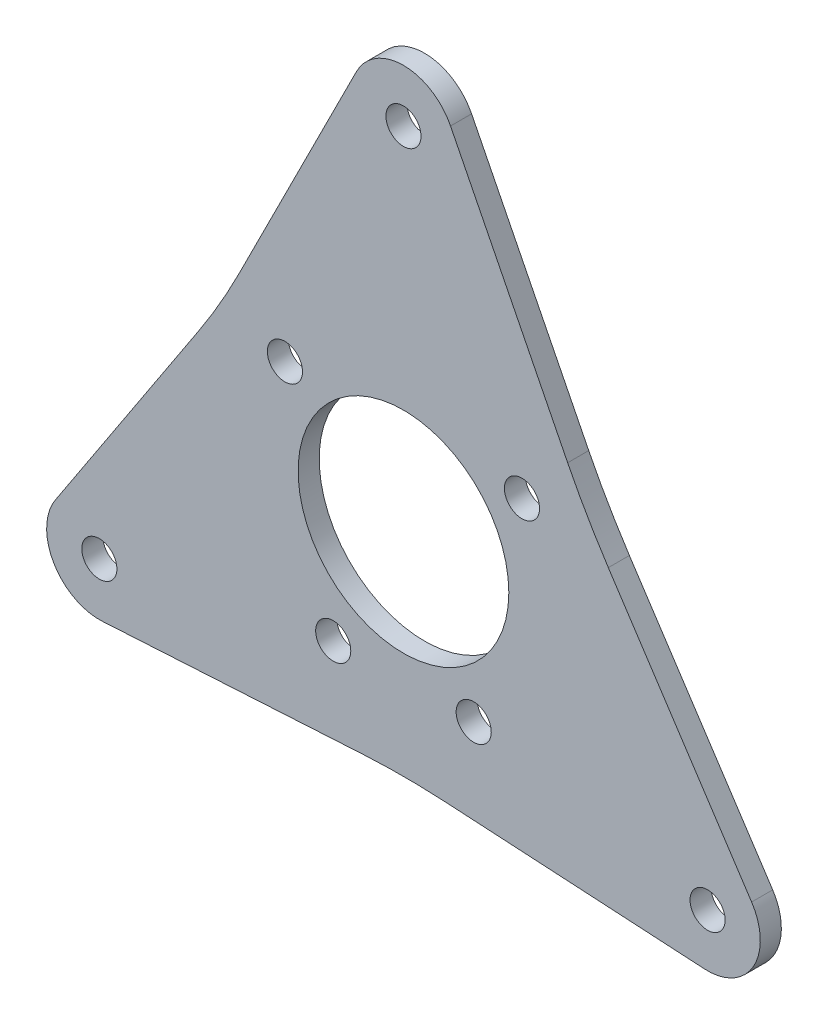
ISO-10303-21;
HEADER;
FILE_DESCRIPTION(('STEP AP214'),'2;1');
FILE_NAME('part.step','',(''),(''),'','','');
FILE_SCHEMA(('AUTOMOTIVE_DESIGN { 1 0 10303 214 1 1 1 1 }'));
ENDSEC;
DATA;
#1=APPLICATION_CONTEXT('core data for automotive mechanical design processes');
#2=APPLICATION_PROTOCOL_DEFINITION('international standard','automotive_design',2000,#1);
#3=PRODUCT_CONTEXT('',#1,'mechanical');
#4=PRODUCT('Part','Part','',(#3));
#5=PRODUCT_RELATED_PRODUCT_CATEGORY('part','',(#4));
#6=PRODUCT_DEFINITION_FORMATION('','',#4);
#7=PRODUCT_DEFINITION_CONTEXT('part definition',#1,'design');
#8=PRODUCT_DEFINITION('design','',#6,#7);
#9=PRODUCT_DEFINITION_SHAPE('','',#8);
#10=(LENGTH_UNIT() NAMED_UNIT(*) SI_UNIT(.MILLI.,.METRE.));
#11=(NAMED_UNIT(*) PLANE_ANGLE_UNIT() SI_UNIT($,.RADIAN.));
#12=(NAMED_UNIT(*) SI_UNIT($,.STERADIAN.) SOLID_ANGLE_UNIT());
#13=UNCERTAINTY_MEASURE_WITH_UNIT(LENGTH_MEASURE(1.E-05),#10,'distance_accuracy_value','');
#14=(GEOMETRIC_REPRESENTATION_CONTEXT(3) GLOBAL_UNCERTAINTY_ASSIGNED_CONTEXT((#13)) GLOBAL_UNIT_ASSIGNED_CONTEXT((#10,
#11,#12)) REPRESENTATION_CONTEXT('',''));
#15=CARTESIAN_POINT('',(0.,0.,0.));
#16=DIRECTION('',(0.,0.,1.));
#17=DIRECTION('',(1.,0.,0.));
#18=AXIS2_PLACEMENT_3D('',#15,#16,#17);
#19=CARTESIAN_POINT('',(-86.6025403784439,-50.,6.));
#20=DIRECTION('',(0.,0.,1.));
#21=DIRECTION('',(1.,0.,0.));
#22=AXIS2_PLACEMENT_3D('',#19,#20,#21);
#23=PLANE('',#22);
#24=CARTESIAN_POINT('',(-20.,-36.9323706252388,6.));
#25=DIRECTION('',(0.,0.,1.));
#26=DIRECTION('',(1.,0.,0.));
#27=AXIS2_PLACEMENT_3D('',#24,#25,#26);
#28=CIRCLE('',#27,5.);
#29=CARTESIAN_POINT('',(-15.,-36.9323706252388,6.));
#30=VERTEX_POINT('',#29);
#31=EDGE_CURVE('E309',#30,#30,#28,.T.);
#32=ORIENTED_EDGE('',*,*,#31,.F.);
#33=EDGE_LOOP('',(#32));
#34=FACE_BOUND('',#33,.T.);
#35=CARTESIAN_POINT('',(-33.75,25.0610766091262,6.));
#36=DIRECTION('',(0.,0.,1.));
#37=DIRECTION('',(1.,0.,0.));
#38=AXIS2_PLACEMENT_3D('',#35,#36,#37);
#39=CIRCLE('',#38,5.);
#40=CARTESIAN_POINT('',(-28.75,25.0610766091262,6.));
#41=VERTEX_POINT('',#40);
#42=EDGE_CURVE('E321',#41,#41,#39,.T.);
#43=ORIENTED_EDGE('',*,*,#42,.F.);
#44=EDGE_LOOP('',(#43));
#45=FACE_BOUND('',#44,.T.);
#46=CARTESIAN_POINT('',(86.6025403784439,-50.,6.));
#47=DIRECTION('',(0.,0.,1.));
#48=DIRECTION('',(1.,0.,0.));
#49=AXIS2_PLACEMENT_3D('',#46,#47,#48);
#50=CIRCLE('',#49,4.99999999999999);
#51=CARTESIAN_POINT('',(91.6025403784439,-50.,6.));
#52=VERTEX_POINT('',#51);
#53=EDGE_CURVE('E333',#52,#52,#50,.T.);
#54=ORIENTED_EDGE('',*,*,#53,.F.);
#55=EDGE_LOOP('',(#54));
#56=FACE_BOUND('',#55,.T.);
#57=CARTESIAN_POINT('',(0.,100.,6.));
#58=DIRECTION('',(0.,0.,1.));
#59=DIRECTION('',(1.,0.,0.));
#60=AXIS2_PLACEMENT_3D('',#57,#58,#59);
#61=CIRCLE('',#60,5.00000000000001);
#62=CARTESIAN_POINT('',(5.00000000000005,100.,6.));
#63=VERTEX_POINT('',#62);
#64=EDGE_CURVE('E160',#63,#63,#61,.T.);
#65=ORIENTED_EDGE('',*,*,#64,.F.);
#66=EDGE_LOOP('',(#65));
#67=FACE_BOUND('',#66,.T.);
#68=CARTESIAN_POINT('',(-86.6025403784439,-50.,6.));
#69=DIRECTION('',(0.,0.,1.));
#70=DIRECTION('',(1.,0.,0.));
#71=AXIS2_PLACEMENT_3D('',#68,#69,#70);
#72=CIRCLE('',#71,15.);
#73=CARTESIAN_POINT('',(-99.1366397981605,-41.7600757444828,6.));
#74=VERTEX_POINT('',#73);
#75=CARTESIAN_POINT('',(-85.7336063577647,-64.974810638793,6.));
#76=VERTEX_POINT('',#75);
#77=EDGE_CURVE('E179',#74,#76,#72,.T.);
#78=ORIENTED_EDGE('',*,*,#77,.T.);
#79=DIRECTION('',(0.998320709252863,0.0579289347119454,0.));
#80=VECTOR('',#79,1.);
#81=CARTESIAN_POINT('',(-85.7336063577647,-64.974810638793,6.));
#82=LINE('',#81,#80);
#83=CARTESIAN_POINT('',(-11.5857869423888,-60.6722812510564,6.));
#84=VERTEX_POINT('',#83);
#85=EDGE_CURVE('E107',#76,#84,#82,.T.);
#86=ORIENTED_EDGE('',*,*,#85,.T.);
#87=CARTESIAN_POINT('',(0.,-260.336423101629,6.));
#88=DIRECTION('',(0.,0.,-1.));
#89=DIRECTION('',(-1.,0.,0.));
#90=AXIS2_PLACEMENT_3D('',#87,#88,#89);
#91=CIRCLE('',#90,200.);
#92=CARTESIAN_POINT('',(11.5857869423888,-60.6722812510564,6.));
#93=VERTEX_POINT('',#92);
#94=EDGE_CURVE('E206',#84,#93,#91,.T.);
#95=ORIENTED_EDGE('',*,*,#94,.T.);
#96=DIRECTION('',(0.998320709252863,-0.0579289347119454,0.));
#97=VECTOR('',#96,1.);
#98=CARTESIAN_POINT('',(11.5857869423888,-60.6722812510564,6.));
#99=LINE('',#98,#97);
#100=CARTESIAN_POINT('',(85.7336063577647,-64.974810638793,6.));
#101=VERTEX_POINT('',#100);
#102=EDGE_CURVE('E225',#93,#101,#99,.T.);
#103=ORIENTED_EDGE('',*,*,#102,.T.);
#104=CARTESIAN_POINT('',(86.6025403784439,-50.,6.));
#105=DIRECTION('',(0.,0.,1.));
#106=DIRECTION('',(1.,0.,0.));
#107=AXIS2_PLACEMENT_3D('',#104,#105,#106);
#108=CIRCLE('',#107,15.);
#109=CARTESIAN_POINT('',(99.1366397981605,-41.7600757444828,6.));
#110=VERTEX_POINT('',#109);
#111=EDGE_CURVE('E222',#101,#110,#108,.T.);
#112=ORIENTED_EDGE('',*,*,#111,.T.);
#113=DIRECTION('',(-0.549328283701145,0.835606627981106,0.));
#114=VECTOR('',#113,1.);
#115=CARTESIAN_POINT('',(58.3366303401639,20.3025548105852,6.));
#116=LINE('',#115,#114);
#117=CARTESIAN_POINT('',(58.3366303401638,20.3025548105853,6.));
#118=VERTEX_POINT('',#117);
#119=EDGE_CURVE('E224',#110,#118,#116,.T.);
#120=ORIENTED_EDGE('',*,*,#119,.T.);
#121=CARTESIAN_POINT('',(225.457955936385,130.168211550814,6.));
#122=DIRECTION('',(0.,0.,-1.));
#123=DIRECTION('',(1.,0.,0.));
#124=AXIS2_PLACEMENT_3D('',#121,#122,#123);
#125=CIRCLE('',#124,200.);
#126=CARTESIAN_POINT('',(46.750843397775,40.3697264404707,6.));
#127=VERTEX_POINT('',#126);
#128=EDGE_CURVE('E227',#118,#127,#125,.T.);
#129=ORIENTED_EDGE('',*,*,#128,.T.);
#130=DIRECTION('',(-0.448992425551717,0.89353556269305,0.));
#131=VECTOR('',#130,1.);
#132=CARTESIAN_POINT('',(13.4030334403958,106.734886383276,6.));
#133=LINE('',#132,#131);
#134=CARTESIAN_POINT('',(13.4030334403958,106.734886383276,6.));
#135=VERTEX_POINT('',#134);
#136=EDGE_CURVE('E233',#127,#135,#133,.T.);
#137=ORIENTED_EDGE('',*,*,#136,.T.);
#138=CARTESIAN_POINT('',(0.,100.,6.));
#139=DIRECTION('',(0.,0.,1.));
#140=DIRECTION('',(1.,0.,0.));
#141=AXIS2_PLACEMENT_3D('',#138,#139,#140);
#142=CIRCLE('',#141,15.);
#143=CARTESIAN_POINT('',(-13.4030334403958,106.734886383276,6.));
#144=VERTEX_POINT('',#143);
#145=EDGE_CURVE('E138',#135,#144,#142,.T.);
#146=ORIENTED_EDGE('',*,*,#145,.T.);
#147=DIRECTION('',(-0.448992425551717,-0.89353556269305,0.));
#148=VECTOR('',#147,1.);
#149=CARTESIAN_POINT('',(-46.750843397775,40.3697264404707,6.));
#150=LINE('',#149,#148);
#151=CARTESIAN_POINT('',(-46.750843397775,40.3697264404707,6.));
#152=VERTEX_POINT('',#151);
#153=EDGE_CURVE('E132',#144,#152,#150,.T.);
#154=ORIENTED_EDGE('',*,*,#153,.T.);
#155=CARTESIAN_POINT('',(-225.457955936385,130.168211550814,6.));
#156=DIRECTION('',(0.,0.,-1.));
#157=DIRECTION('',(1.,0.,0.));
#158=AXIS2_PLACEMENT_3D('',#155,#156,#157);
#159=CIRCLE('',#158,200.);
#160=CARTESIAN_POINT('',(-58.3366303401639,20.3025548105852,6.));
#161=VERTEX_POINT('',#160);
#162=EDGE_CURVE('E136',#152,#161,#159,.T.);
#163=ORIENTED_EDGE('',*,*,#162,.T.);
#164=DIRECTION('',(-0.549328283701145,-0.835606627981106,0.));
#165=VECTOR('',#164,1.);
#166=CARTESIAN_POINT('',(-99.1366397981605,-41.7600757444828,6.));
#167=LINE('',#166,#165);
#168=EDGE_CURVE('E52',#161,#74,#167,.T.);
#169=ORIENTED_EDGE('',*,*,#168,.T.);
#170=EDGE_LOOP('',(#78,#86,#95,#103,#112,#120,#129,#137,#146,#154,#163,#169));
#171=FACE_BOUND('',#170,.T.);
#172=CARTESIAN_POINT('',(0.,0.,6.));
#173=DIRECTION('',(0.,0.,1.));
#174=DIRECTION('',(1.,0.,0.));
#175=AXIS2_PLACEMENT_3D('',#172,#173,#174);
#176=CIRCLE('',#175,30.);
#177=CARTESIAN_POINT('',(30.,0.,6.));
#178=VERTEX_POINT('',#177);
#179=EDGE_CURVE('E339',#178,#178,#176,.T.);
#180=ORIENTED_EDGE('',*,*,#179,.F.);
#181=EDGE_LOOP('',(#180));
#182=FACE_BOUND('',#181,.T.);
#183=CARTESIAN_POINT('',(-86.6025403784439,-50.,6.));
#184=DIRECTION('',(0.,0.,1.));
#185=DIRECTION('',(1.,0.,0.));
#186=AXIS2_PLACEMENT_3D('',#183,#184,#185);
#187=CIRCLE('',#186,5.00000000000002);
#188=CARTESIAN_POINT('',(-81.6025403784439,-50.,6.));
#189=VERTEX_POINT('',#188);
#190=EDGE_CURVE('E327',#189,#189,#187,.T.);
#191=ORIENTED_EDGE('',*,*,#190,.F.);
#192=EDGE_LOOP('',(#191));
#193=FACE_BOUND('',#192,.T.);
#194=CARTESIAN_POINT('',(33.75,25.0610766091262,6.));
#195=DIRECTION('',(0.,0.,1.));
#196=DIRECTION('',(1.,0.,0.));
#197=AXIS2_PLACEMENT_3D('',#194,#195,#196);
#198=CIRCLE('',#197,4.99999999999999);
#199=CARTESIAN_POINT('',(38.75,25.0610766091262,6.));
#200=VERTEX_POINT('',#199);
#201=EDGE_CURVE('E315',#200,#200,#198,.T.);
#202=ORIENTED_EDGE('',*,*,#201,.F.);
#203=EDGE_LOOP('',(#202));
#204=FACE_BOUND('',#203,.T.);
#205=CARTESIAN_POINT('',(20.,-36.9323706252388,6.));
#206=DIRECTION('',(0.,0.,1.));
#207=DIRECTION('',(1.,0.,0.));
#208=AXIS2_PLACEMENT_3D('',#205,#206,#207);
#209=CIRCLE('',#208,5.);
#210=CARTESIAN_POINT('',(25.,-36.9323706252388,6.));
#211=VERTEX_POINT('',#210);
#212=EDGE_CURVE('E300',#211,#211,#209,.T.);
#213=ORIENTED_EDGE('',*,*,#212,.F.);
#214=EDGE_LOOP('',(#213));
#215=FACE_BOUND('',#214,.T.);
#216=ADVANCED_FACE('F35',(#34,#45,#56,#67,#171,#182,#193,#204,#215),#23,.T.);
#217=CARTESIAN_POINT('',(-86.6025403784439,-50.,0.));
#218=DIRECTION('',(0.,0.,1.));
#219=DIRECTION('',(1.,0.,0.));
#220=AXIS2_PLACEMENT_3D('',#217,#218,#219);
#221=PLANE('',#220);
#222=CARTESIAN_POINT('',(-86.6025403784439,-50.,0.));
#223=DIRECTION('',(0.,0.,1.));
#224=DIRECTION('',(1.,0.,0.));
#225=AXIS2_PLACEMENT_3D('',#222,#223,#224);
#226=CIRCLE('',#225,15.);
#227=CARTESIAN_POINT('',(-99.1366397981605,-41.7600757444828,0.));
#228=VERTEX_POINT('',#227);
#229=CARTESIAN_POINT('',(-85.7336063577647,-64.974810638793,0.));
#230=VERTEX_POINT('',#229);
#231=EDGE_CURVE('E156',#228,#230,#226,.T.);
#232=ORIENTED_EDGE('',*,*,#231,.F.);
#233=DIRECTION('',(-0.549328283701145,-0.835606627981106,0.));
#234=VECTOR('',#233,1.);
#235=CARTESIAN_POINT('',(-99.1366397981605,-41.7600757444828,0.));
#236=LINE('',#235,#234);
#237=CARTESIAN_POINT('',(-58.3366303401639,20.3025548105852,0.));
#238=VERTEX_POINT('',#237);
#239=EDGE_CURVE('E99',#238,#228,#236,.T.);
#240=ORIENTED_EDGE('',*,*,#239,.F.);
#241=CARTESIAN_POINT('',(-225.457955936385,130.168211550814,0.));
#242=DIRECTION('',(0.,0.,-1.));
#243=DIRECTION('',(1.,0.,0.));
#244=AXIS2_PLACEMENT_3D('',#241,#242,#243);
#245=CIRCLE('',#244,200.);
#246=CARTESIAN_POINT('',(-46.750843397775,40.3697264404707,0.));
#247=VERTEX_POINT('',#246);
#248=EDGE_CURVE('E93',#247,#238,#245,.T.);
#249=ORIENTED_EDGE('',*,*,#248,.F.);
#250=DIRECTION('',(-0.448992425551717,-0.89353556269305,0.));
#251=VECTOR('',#250,1.);
#252=CARTESIAN_POINT('',(-46.750843397775,40.3697264404707,0.));
#253=LINE('',#252,#251);
#254=CARTESIAN_POINT('',(-13.4030334403958,106.734886383276,0.));
#255=VERTEX_POINT('',#254);
#256=EDGE_CURVE('E146',#255,#247,#253,.T.);
#257=ORIENTED_EDGE('',*,*,#256,.F.);
#258=CARTESIAN_POINT('',(0.,100.,0.));
#259=DIRECTION('',(0.,0.,1.));
#260=DIRECTION('',(1.,0.,0.));
#261=AXIS2_PLACEMENT_3D('',#258,#259,#260);
#262=CIRCLE('',#261,15.);
#263=CARTESIAN_POINT('',(13.4030334403958,106.734886383276,0.));
#264=VERTEX_POINT('',#263);
#265=EDGE_CURVE('E174',#264,#255,#262,.T.);
#266=ORIENTED_EDGE('',*,*,#265,.F.);
#267=DIRECTION('',(-0.448992425551717,0.89353556269305,0.));
#268=VECTOR('',#267,1.);
#269=CARTESIAN_POINT('',(13.4030334403958,106.734886383276,0.));
#270=LINE('',#269,#268);
#271=CARTESIAN_POINT('',(46.750843397775,40.3697264404707,0.));
#272=VERTEX_POINT('',#271);
#273=EDGE_CURVE('E172',#272,#264,#270,.T.);
#274=ORIENTED_EDGE('',*,*,#273,.F.);
#275=CARTESIAN_POINT('',(225.457955936385,130.168211550814,0.));
#276=DIRECTION('',(0.,0.,-1.));
#277=DIRECTION('',(1.,0.,0.));
#278=AXIS2_PLACEMENT_3D('',#275,#276,#277);
#279=CIRCLE('',#278,200.);
#280=CARTESIAN_POINT('',(58.3366303401638,20.3025548105853,0.));
#281=VERTEX_POINT('',#280);
#282=EDGE_CURVE('E170',#281,#272,#279,.T.);
#283=ORIENTED_EDGE('',*,*,#282,.F.);
#284=DIRECTION('',(-0.549328283701145,0.835606627981106,0.));
#285=VECTOR('',#284,1.);
#286=CARTESIAN_POINT('',(58.3366303401639,20.3025548105852,0.));
#287=LINE('',#286,#285);
#288=CARTESIAN_POINT('',(99.1366397981605,-41.7600757444828,0.));
#289=VERTEX_POINT('',#288);
#290=EDGE_CURVE('E168',#289,#281,#287,.T.);
#291=ORIENTED_EDGE('',*,*,#290,.F.);
#292=CARTESIAN_POINT('',(86.6025403784439,-50.,0.));
#293=DIRECTION('',(0.,0.,1.));
#294=DIRECTION('',(1.,0.,0.));
#295=AXIS2_PLACEMENT_3D('',#292,#293,#294);
#296=CIRCLE('',#295,15.);
#297=CARTESIAN_POINT('',(85.7336063577647,-64.974810638793,0.));
#298=VERTEX_POINT('',#297);
#299=EDGE_CURVE('E166',#298,#289,#296,.T.);
#300=ORIENTED_EDGE('',*,*,#299,.F.);
#301=DIRECTION('',(0.998320709252863,-0.0579289347119454,0.));
#302=VECTOR('',#301,1.);
#303=CARTESIAN_POINT('',(11.5857869423888,-60.6722812510564,0.));
#304=LINE('',#303,#302);
#305=CARTESIAN_POINT('',(11.5857869423888,-60.6722812510564,0.));
#306=VERTEX_POINT('',#305);
#307=EDGE_CURVE('E164',#306,#298,#304,.T.);
#308=ORIENTED_EDGE('',*,*,#307,.F.);
#309=CARTESIAN_POINT('',(0.,-260.336423101629,0.));
#310=DIRECTION('',(0.,0.,-1.));
#311=DIRECTION('',(-1.,0.,0.));
#312=AXIS2_PLACEMENT_3D('',#309,#310,#311);
#313=CIRCLE('',#312,200.);
#314=CARTESIAN_POINT('',(-11.5857869423888,-60.6722812510564,0.));
#315=VERTEX_POINT('',#314);
#316=EDGE_CURVE('E162',#315,#306,#313,.T.);
#317=ORIENTED_EDGE('',*,*,#316,.F.);
#318=DIRECTION('',(0.998320709252863,0.0579289347119454,0.));
#319=VECTOR('',#318,1.);
#320=CARTESIAN_POINT('',(-85.7336063577647,-64.974810638793,0.));
#321=LINE('',#320,#319);
#322=EDGE_CURVE('E159',#230,#315,#321,.T.);
#323=ORIENTED_EDGE('',*,*,#322,.F.);
#324=EDGE_LOOP('',(#232,#240,#249,#257,#266,#274,#283,#291,#300,#308,#317,#323));
#325=FACE_BOUND('',#324,.T.);
#326=CARTESIAN_POINT('',(0.,100.,0.));
#327=DIRECTION('',(0.,0.,1.));
#328=DIRECTION('',(1.,0.,0.));
#329=AXIS2_PLACEMENT_3D('',#326,#327,#328);
#330=CIRCLE('',#329,5.00000000000001);
#331=CARTESIAN_POINT('',(5.00000000000005,100.,0.));
#332=VERTEX_POINT('',#331);
#333=EDGE_CURVE('E342',#332,#332,#330,.T.);
#334=ORIENTED_EDGE('',*,*,#333,.T.);
#335=EDGE_LOOP('',(#334));
#336=FACE_BOUND('',#335,.T.);
#337=CARTESIAN_POINT('',(0.,0.,0.));
#338=DIRECTION('',(0.,0.,1.));
#339=DIRECTION('',(1.,0.,0.));
#340=AXIS2_PLACEMENT_3D('',#337,#338,#339);
#341=CIRCLE('',#340,30.);
#342=CARTESIAN_POINT('',(30.,0.,0.));
#343=VERTEX_POINT('',#342);
#344=EDGE_CURVE('E336',#343,#343,#341,.T.);
#345=ORIENTED_EDGE('',*,*,#344,.T.);
#346=EDGE_LOOP('',(#345));
#347=FACE_BOUND('',#346,.T.);
#348=CARTESIAN_POINT('',(86.6025403784439,-50.,0.));
#349=DIRECTION('',(0.,0.,1.));
#350=DIRECTION('',(1.,0.,0.));
#351=AXIS2_PLACEMENT_3D('',#348,#349,#350);
#352=CIRCLE('',#351,4.99999999999999);
#353=CARTESIAN_POINT('',(91.6025403784439,-50.,0.));
#354=VERTEX_POINT('',#353);
#355=EDGE_CURVE('E330',#354,#354,#352,.T.);
#356=ORIENTED_EDGE('',*,*,#355,.T.);
#357=EDGE_LOOP('',(#356));
#358=FACE_BOUND('',#357,.T.);
#359=CARTESIAN_POINT('',(-86.6025403784439,-50.,0.));
#360=DIRECTION('',(0.,0.,1.));
#361=DIRECTION('',(1.,0.,0.));
#362=AXIS2_PLACEMENT_3D('',#359,#360,#361);
#363=CIRCLE('',#362,5.00000000000002);
#364=CARTESIAN_POINT('',(-81.6025403784439,-50.,0.));
#365=VERTEX_POINT('',#364);
#366=EDGE_CURVE('E324',#365,#365,#363,.T.);
#367=ORIENTED_EDGE('',*,*,#366,.T.);
#368=EDGE_LOOP('',(#367));
#369=FACE_BOUND('',#368,.T.);
#370=CARTESIAN_POINT('',(-33.75,25.0610766091262,0.));
#371=DIRECTION('',(0.,0.,1.));
#372=DIRECTION('',(1.,0.,0.));
#373=AXIS2_PLACEMENT_3D('',#370,#371,#372);
#374=CIRCLE('',#373,5.);
#375=CARTESIAN_POINT('',(-28.75,25.0610766091262,0.));
#376=VERTEX_POINT('',#375);
#377=EDGE_CURVE('E318',#376,#376,#374,.T.);
#378=ORIENTED_EDGE('',*,*,#377,.T.);
#379=EDGE_LOOP('',(#378));
#380=FACE_BOUND('',#379,.T.);
#381=CARTESIAN_POINT('',(33.75,25.0610766091262,0.));
#382=DIRECTION('',(0.,0.,1.));
#383=DIRECTION('',(1.,0.,0.));
#384=AXIS2_PLACEMENT_3D('',#381,#382,#383);
#385=CIRCLE('',#384,4.99999999999999);
#386=CARTESIAN_POINT('',(38.75,25.0610766091262,0.));
#387=VERTEX_POINT('',#386);
#388=EDGE_CURVE('E312',#387,#387,#385,.T.);
#389=ORIENTED_EDGE('',*,*,#388,.T.);
#390=EDGE_LOOP('',(#389));
#391=FACE_BOUND('',#390,.T.);
#392=CARTESIAN_POINT('',(-20.,-36.9323706252388,0.));
#393=DIRECTION('',(0.,0.,1.));
#394=DIRECTION('',(1.,0.,0.));
#395=AXIS2_PLACEMENT_3D('',#392,#393,#394);
#396=CIRCLE('',#395,5.);
#397=CARTESIAN_POINT('',(-15.,-36.9323706252388,0.));
#398=VERTEX_POINT('',#397);
#399=EDGE_CURVE('E306',#398,#398,#396,.T.);
#400=ORIENTED_EDGE('',*,*,#399,.T.);
#401=EDGE_LOOP('',(#400));
#402=FACE_BOUND('',#401,.T.);
#403=CARTESIAN_POINT('',(20.,-36.9323706252388,0.));
#404=DIRECTION('',(0.,0.,1.));
#405=DIRECTION('',(1.,0.,0.));
#406=AXIS2_PLACEMENT_3D('',#403,#404,#405);
#407=CIRCLE('',#406,5.);
#408=CARTESIAN_POINT('',(25.,-36.9323706252388,0.));
#409=VERTEX_POINT('',#408);
#410=EDGE_CURVE('E303',#409,#409,#407,.T.);
#411=ORIENTED_EDGE('',*,*,#410,.T.);
#412=EDGE_LOOP('',(#411));
#413=FACE_BOUND('',#412,.T.);
#414=ADVANCED_FACE('F210',(#325,#336,#347,#358,#369,#380,#391,#402,#413),#221,.F.);
#415=CARTESIAN_POINT('',(-86.6025403784439,-50.,6.));
#416=DIRECTION('',(0.,0.,-1.));
#417=DIRECTION('',(-1.,0.,0.));
#418=AXIS2_PLACEMENT_3D('',#415,#416,#417);
#419=CYLINDRICAL_SURFACE('',#418,15.);
#420=ORIENTED_EDGE('',*,*,#231,.T.);
#421=DIRECTION('',(0.,0.,-1.));
#422=VECTOR('',#421,1.);
#423=CARTESIAN_POINT('',(-85.7336063577647,-64.974810638793,6.));
#424=LINE('',#423,#422);
#425=EDGE_CURVE('E11',#76,#230,#424,.T.);
#426=ORIENTED_EDGE('',*,*,#425,.F.);
#427=ORIENTED_EDGE('',*,*,#77,.F.);
#428=DIRECTION('',(0.,0.,-1.));
#429=VECTOR('',#428,1.);
#430=CARTESIAN_POINT('',(-99.1366397981605,-41.7600757444828,6.));
#431=LINE('',#430,#429);
#432=EDGE_CURVE('E152',#74,#228,#431,.T.);
#433=ORIENTED_EDGE('',*,*,#432,.T.);
#434=EDGE_LOOP('',(#420,#426,#427,#433));
#435=FACE_BOUND('',#434,.T.);
#436=ADVANCED_FACE('F37',(#435),#419,.T.);
#437=CARTESIAN_POINT('',(-85.7336063577647,-64.974810638793,6.));
#438=DIRECTION('',(-0.0579289347119454,0.998320709252863,0.));
#439=DIRECTION('',(-0.998320709252863,-0.0579289347119454,0.));
#440=AXIS2_PLACEMENT_3D('',#437,#438,#439);
#441=PLANE('',#440);
#442=ORIENTED_EDGE('',*,*,#322,.T.);
#443=DIRECTION('',(0.,0.,-1.));
#444=VECTOR('',#443,1.);
#445=CARTESIAN_POINT('',(-11.5857869423888,-60.6722812510564,6.));
#446=LINE('',#445,#444);
#447=EDGE_CURVE('E44',#84,#315,#446,.T.);
#448=ORIENTED_EDGE('',*,*,#447,.F.);
#449=ORIENTED_EDGE('',*,*,#85,.F.);
#450=ORIENTED_EDGE('',*,*,#425,.T.);
#451=EDGE_LOOP('',(#442,#448,#449,#450));
#452=FACE_BOUND('',#451,.T.);
#453=ADVANCED_FACE('F488',(#452),#441,.F.);
#454=CARTESIAN_POINT('',(0.,-260.336423101629,6.));
#455=DIRECTION('',(0.,0.,-1.));
#456=DIRECTION('',(-1.,0.,0.));
#457=AXIS2_PLACEMENT_3D('',#454,#455,#456);
#458=CYLINDRICAL_SURFACE('',#457,200.);
#459=ORIENTED_EDGE('',*,*,#316,.T.);
#460=DIRECTION('',(0.,0.,-1.));
#461=VECTOR('',#460,1.);
#462=CARTESIAN_POINT('',(11.5857869423888,-60.6722812510564,6.));
#463=LINE('',#462,#461);
#464=EDGE_CURVE('E198',#93,#306,#463,.T.);
#465=ORIENTED_EDGE('',*,*,#464,.F.);
#466=ORIENTED_EDGE('',*,*,#94,.F.);
#467=ORIENTED_EDGE('',*,*,#447,.T.);
#468=EDGE_LOOP('',(#459,#465,#466,#467));
#469=FACE_BOUND('',#468,.T.);
#470=ADVANCED_FACE('F204',(#469),#458,.F.);
#471=CARTESIAN_POINT('',(11.5857869423888,-60.6722812510564,6.));
#472=DIRECTION('',(0.0579289347119454,0.998320709252863,0.));
#473=DIRECTION('',(-0.998320709252863,0.0579289347119454,0.));
#474=AXIS2_PLACEMENT_3D('',#471,#472,#473);
#475=PLANE('',#474);
#476=ORIENTED_EDGE('',*,*,#307,.T.);
#477=DIRECTION('',(0.,0.,-1.));
#478=VECTOR('',#477,1.);
#479=CARTESIAN_POINT('',(85.7336063577647,-64.974810638793,6.));
#480=LINE('',#479,#478);
#481=EDGE_CURVE('E195',#101,#298,#480,.T.);
#482=ORIENTED_EDGE('',*,*,#481,.F.);
#483=ORIENTED_EDGE('',*,*,#102,.F.);
#484=ORIENTED_EDGE('',*,*,#464,.T.);
#485=EDGE_LOOP('',(#476,#482,#483,#484));
#486=FACE_BOUND('',#485,.T.);
#487=ADVANCED_FACE('F216',(#486),#475,.F.);
#488=CARTESIAN_POINT('',(86.6025403784439,-50.,6.));
#489=DIRECTION('',(0.,0.,-1.));
#490=DIRECTION('',(-1.,0.,0.));
#491=AXIS2_PLACEMENT_3D('',#488,#489,#490);
#492=CYLINDRICAL_SURFACE('',#491,15.);
#493=ORIENTED_EDGE('',*,*,#299,.T.);
#494=DIRECTION('',(0.,0.,-1.));
#495=VECTOR('',#494,1.);
#496=CARTESIAN_POINT('',(99.1366397981605,-41.7600757444828,6.));
#497=LINE('',#496,#495);
#498=EDGE_CURVE('E192',#110,#289,#497,.T.);
#499=ORIENTED_EDGE('',*,*,#498,.F.);
#500=ORIENTED_EDGE('',*,*,#111,.F.);
#501=ORIENTED_EDGE('',*,*,#481,.T.);
#502=EDGE_LOOP('',(#493,#499,#500,#501));
#503=FACE_BOUND('',#502,.T.);
#504=ADVANCED_FACE('F220',(#503),#492,.T.);
#505=CARTESIAN_POINT('',(58.3366303401639,20.3025548105852,6.));
#506=DIRECTION('',(-0.835606627981106,-0.549328283701145,0.));
#507=DIRECTION('',(0.549328283701145,-0.835606627981106,0.));
#508=AXIS2_PLACEMENT_3D('',#505,#506,#507);
#509=PLANE('',#508);
#510=ORIENTED_EDGE('',*,*,#290,.T.);
#511=DIRECTION('',(0.,0.,-1.));
#512=VECTOR('',#511,1.);
#513=CARTESIAN_POINT('',(58.3366303401638,20.3025548105853,6.));
#514=LINE('',#513,#512);
#515=EDGE_CURVE('E189',#118,#281,#514,.T.);
#516=ORIENTED_EDGE('',*,*,#515,.F.);
#517=ORIENTED_EDGE('',*,*,#119,.F.);
#518=ORIENTED_EDGE('',*,*,#498,.T.);
#519=EDGE_LOOP('',(#510,#516,#517,#518));
#520=FACE_BOUND('',#519,.T.);
#521=ADVANCED_FACE('F453',(#520),#509,.F.);
#522=CARTESIAN_POINT('',(225.457955936385,130.168211550814,6.));
#523=DIRECTION('',(0.,0.,-1.));
#524=DIRECTION('',(-1.,0.,0.));
#525=AXIS2_PLACEMENT_3D('',#522,#523,#524);
#526=CYLINDRICAL_SURFACE('',#525,200.);
#527=ORIENTED_EDGE('',*,*,#282,.T.);
#528=DIRECTION('',(0.,0.,-1.));
#529=VECTOR('',#528,1.);
#530=CARTESIAN_POINT('',(46.750843397775,40.3697264404707,6.));
#531=LINE('',#530,#529);
#532=EDGE_CURVE('E186',#127,#272,#531,.T.);
#533=ORIENTED_EDGE('',*,*,#532,.F.);
#534=ORIENTED_EDGE('',*,*,#128,.F.);
#535=ORIENTED_EDGE('',*,*,#515,.T.);
#536=EDGE_LOOP('',(#527,#533,#534,#535));
#537=FACE_BOUND('',#536,.T.);
#538=ADVANCED_FACE('F444',(#537),#526,.F.);
#539=CARTESIAN_POINT('',(13.4030334403958,106.734886383276,6.));
#540=DIRECTION('',(-0.89353556269305,-0.448992425551717,0.));
#541=DIRECTION('',(0.448992425551717,-0.89353556269305,0.));
#542=AXIS2_PLACEMENT_3D('',#539,#540,#541);
#543=PLANE('',#542);
#544=ORIENTED_EDGE('',*,*,#273,.T.);
#545=DIRECTION('',(0.,0.,-1.));
#546=VECTOR('',#545,1.);
#547=CARTESIAN_POINT('',(13.4030334403958,106.734886383276,6.));
#548=LINE('',#547,#546);
#549=EDGE_CURVE('E183',#135,#264,#548,.T.);
#550=ORIENTED_EDGE('',*,*,#549,.F.);
#551=ORIENTED_EDGE('',*,*,#136,.F.);
#552=ORIENTED_EDGE('',*,*,#532,.T.);
#553=EDGE_LOOP('',(#544,#550,#551,#552));
#554=FACE_BOUND('',#553,.T.);
#555=ADVANCED_FACE('F239',(#554),#543,.F.);
#556=CARTESIAN_POINT('',(0.,100.,6.));
#557=DIRECTION('',(0.,0.,-1.));
#558=DIRECTION('',(-1.,0.,0.));
#559=AXIS2_PLACEMENT_3D('',#556,#557,#558);
#560=CYLINDRICAL_SURFACE('',#559,15.);
#561=ORIENTED_EDGE('',*,*,#265,.T.);
#562=DIRECTION('',(0.,0.,-1.));
#563=VECTOR('',#562,1.);
#564=CARTESIAN_POINT('',(-13.4030334403958,106.734886383276,6.));
#565=LINE('',#564,#563);
#566=EDGE_CURVE('E147',#144,#255,#565,.T.);
#567=ORIENTED_EDGE('',*,*,#566,.F.);
#568=ORIENTED_EDGE('',*,*,#145,.F.);
#569=ORIENTED_EDGE('',*,*,#549,.T.);
#570=EDGE_LOOP('',(#561,#567,#568,#569));
#571=FACE_BOUND('',#570,.T.);
#572=ADVANCED_FACE('F243',(#571),#560,.T.);
#573=CARTESIAN_POINT('',(-46.750843397775,40.3697264404707,6.));
#574=DIRECTION('',(0.89353556269305,-0.448992425551717,0.));
#575=DIRECTION('',(0.448992425551717,0.89353556269305,0.));
#576=AXIS2_PLACEMENT_3D('',#573,#574,#575);
#577=PLANE('',#576);
#578=ORIENTED_EDGE('',*,*,#256,.T.);
#579=DIRECTION('',(0.,0.,-1.));
#580=VECTOR('',#579,1.);
#581=CARTESIAN_POINT('',(-46.750843397775,40.3697264404707,6.));
#582=LINE('',#581,#580);
#583=EDGE_CURVE('E143',#152,#247,#582,.T.);
#584=ORIENTED_EDGE('',*,*,#583,.F.);
#585=ORIENTED_EDGE('',*,*,#153,.F.);
#586=ORIENTED_EDGE('',*,*,#566,.T.);
#587=EDGE_LOOP('',(#578,#584,#585,#586));
#588=FACE_BOUND('',#587,.T.);
#589=ADVANCED_FACE('F144',(#588),#577,.F.);
#590=CARTESIAN_POINT('',(-225.457955936385,130.168211550814,6.));
#591=DIRECTION('',(0.,0.,-1.));
#592=DIRECTION('',(-1.,0.,0.));
#593=AXIS2_PLACEMENT_3D('',#590,#591,#592);
#594=CYLINDRICAL_SURFACE('',#593,200.);
#595=ORIENTED_EDGE('',*,*,#248,.T.);
#596=DIRECTION('',(0.,0.,-1.));
#597=VECTOR('',#596,1.);
#598=CARTESIAN_POINT('',(-58.3366303401639,20.3025548105852,6.));
#599=LINE('',#598,#597);
#600=EDGE_CURVE('E148',#161,#238,#599,.T.);
#601=ORIENTED_EDGE('',*,*,#600,.F.);
#602=ORIENTED_EDGE('',*,*,#162,.F.);
#603=ORIENTED_EDGE('',*,*,#583,.T.);
#604=EDGE_LOOP('',(#595,#601,#602,#603));
#605=FACE_BOUND('',#604,.T.);
#606=ADVANCED_FACE('F150',(#605),#594,.F.);
#607=CARTESIAN_POINT('',(-99.1366397981605,-41.7600757444828,6.));
#608=DIRECTION('',(0.835606627981106,-0.549328283701145,0.));
#609=DIRECTION('',(0.549328283701145,0.835606627981106,0.));
#610=AXIS2_PLACEMENT_3D('',#607,#608,#609);
#611=PLANE('',#610);
#612=ORIENTED_EDGE('',*,*,#239,.T.);
#613=ORIENTED_EDGE('',*,*,#432,.F.);
#614=ORIENTED_EDGE('',*,*,#168,.F.);
#615=ORIENTED_EDGE('',*,*,#600,.T.);
#616=EDGE_LOOP('',(#612,#613,#614,#615));
#617=FACE_BOUND('',#616,.T.);
#618=ADVANCED_FACE('F247',(#617),#611,.F.);
#619=CARTESIAN_POINT('',(0.,100.,6.));
#620=DIRECTION('',(0.,0.,-1.));
#621=DIRECTION('',(-1.,0.,0.));
#622=AXIS2_PLACEMENT_3D('',#619,#620,#621);
#623=CYLINDRICAL_SURFACE('',#622,5.00000000000001);
#624=ORIENTED_EDGE('',*,*,#64,.T.);
#625=EDGE_LOOP('',(#624));
#626=FACE_BOUND('',#625,.T.);
#627=ORIENTED_EDGE('',*,*,#333,.F.);
#628=EDGE_LOOP('',(#627));
#629=FACE_BOUND('',#628,.T.);
#630=ADVANCED_FACE('F249',(#626,#629),#623,.F.);
#631=CARTESIAN_POINT('',(0.,0.,6.));
#632=DIRECTION('',(0.,0.,-1.));
#633=DIRECTION('',(-1.,0.,0.));
#634=AXIS2_PLACEMENT_3D('',#631,#632,#633);
#635=CYLINDRICAL_SURFACE('',#634,30.);
#636=ORIENTED_EDGE('',*,*,#179,.T.);
#637=EDGE_LOOP('',(#636));
#638=FACE_BOUND('',#637,.T.);
#639=ORIENTED_EDGE('',*,*,#344,.F.);
#640=EDGE_LOOP('',(#639));
#641=FACE_BOUND('',#640,.T.);
#642=ADVANCED_FACE('F255',(#638,#641),#635,.F.);
#643=CARTESIAN_POINT('',(86.6025403784439,-50.,6.));
#644=DIRECTION('',(0.,0.,-1.));
#645=DIRECTION('',(-1.,0.,0.));
#646=AXIS2_PLACEMENT_3D('',#643,#644,#645);
#647=CYLINDRICAL_SURFACE('',#646,4.99999999999999);
#648=ORIENTED_EDGE('',*,*,#53,.T.);
#649=EDGE_LOOP('',(#648));
#650=FACE_BOUND('',#649,.T.);
#651=ORIENTED_EDGE('',*,*,#355,.F.);
#652=EDGE_LOOP('',(#651));
#653=FACE_BOUND('',#652,.T.);
#654=ADVANCED_FACE('F271',(#650,#653),#647,.F.);
#655=CARTESIAN_POINT('',(-86.6025403784439,-50.,6.));
#656=DIRECTION('',(0.,0.,-1.));
#657=DIRECTION('',(-1.,0.,0.));
#658=AXIS2_PLACEMENT_3D('',#655,#656,#657);
#659=CYLINDRICAL_SURFACE('',#658,5.00000000000002);
#660=ORIENTED_EDGE('',*,*,#190,.T.);
#661=EDGE_LOOP('',(#660));
#662=FACE_BOUND('',#661,.T.);
#663=ORIENTED_EDGE('',*,*,#366,.F.);
#664=EDGE_LOOP('',(#663));
#665=FACE_BOUND('',#664,.T.);
#666=ADVANCED_FACE('F275',(#662,#665),#659,.F.);
#667=CARTESIAN_POINT('',(-33.75,25.0610766091262,6.));
#668=DIRECTION('',(0.,0.,-1.));
#669=DIRECTION('',(-1.,0.,0.));
#670=AXIS2_PLACEMENT_3D('',#667,#668,#669);
#671=CYLINDRICAL_SURFACE('',#670,5.);
#672=ORIENTED_EDGE('',*,*,#42,.T.);
#673=EDGE_LOOP('',(#672));
#674=FACE_BOUND('',#673,.T.);
#675=ORIENTED_EDGE('',*,*,#377,.F.);
#676=EDGE_LOOP('',(#675));
#677=FACE_BOUND('',#676,.T.);
#678=ADVANCED_FACE('F279',(#674,#677),#671,.F.);
#679=CARTESIAN_POINT('',(33.75,25.0610766091262,6.));
#680=DIRECTION('',(0.,0.,-1.));
#681=DIRECTION('',(-1.,0.,0.));
#682=AXIS2_PLACEMENT_3D('',#679,#680,#681);
#683=CYLINDRICAL_SURFACE('',#682,4.99999999999999);
#684=ORIENTED_EDGE('',*,*,#201,.T.);
#685=EDGE_LOOP('',(#684));
#686=FACE_BOUND('',#685,.T.);
#687=ORIENTED_EDGE('',*,*,#388,.F.);
#688=EDGE_LOOP('',(#687));
#689=FACE_BOUND('',#688,.T.);
#690=ADVANCED_FACE('F283',(#686,#689),#683,.F.);
#691=CARTESIAN_POINT('',(-20.,-36.9323706252388,6.));
#692=DIRECTION('',(0.,0.,-1.));
#693=DIRECTION('',(-1.,0.,0.));
#694=AXIS2_PLACEMENT_3D('',#691,#692,#693);
#695=CYLINDRICAL_SURFACE('',#694,5.);
#696=ORIENTED_EDGE('',*,*,#31,.T.);
#697=EDGE_LOOP('',(#696));
#698=FACE_BOUND('',#697,.T.);
#699=ORIENTED_EDGE('',*,*,#399,.F.);
#700=EDGE_LOOP('',(#699));
#701=FACE_BOUND('',#700,.T.);
#702=ADVANCED_FACE('F287',(#698,#701),#695,.F.);
#703=CARTESIAN_POINT('',(20.,-36.9323706252388,6.));
#704=DIRECTION('',(0.,0.,-1.));
#705=DIRECTION('',(-1.,0.,0.));
#706=AXIS2_PLACEMENT_3D('',#703,#704,#705);
#707=CYLINDRICAL_SURFACE('',#706,5.);
#708=ORIENTED_EDGE('',*,*,#212,.T.);
#709=EDGE_LOOP('',(#708));
#710=FACE_BOUND('',#709,.T.);
#711=ORIENTED_EDGE('',*,*,#410,.F.);
#712=EDGE_LOOP('',(#711));
#713=FACE_BOUND('',#712,.T.);
#714=ADVANCED_FACE('F291',(#710,#713),#707,.F.);
#715=CLOSED_SHELL('',(#216,#414,#436,#453,#470,#487,#504,#521,#538,#555,#572,#589,#606,#618,
#630,#642,#654,#666,#678,#690,#702,#714));
#716=MANIFOLD_SOLID_BREP('B2',#715);
#717=ADVANCED_BREP_SHAPE_REPRESENTATION('',(#18,#716),#14);
#718=SHAPE_DEFINITION_REPRESENTATION(#9,#717);
ENDSEC;
END-ISO-10303-21;
